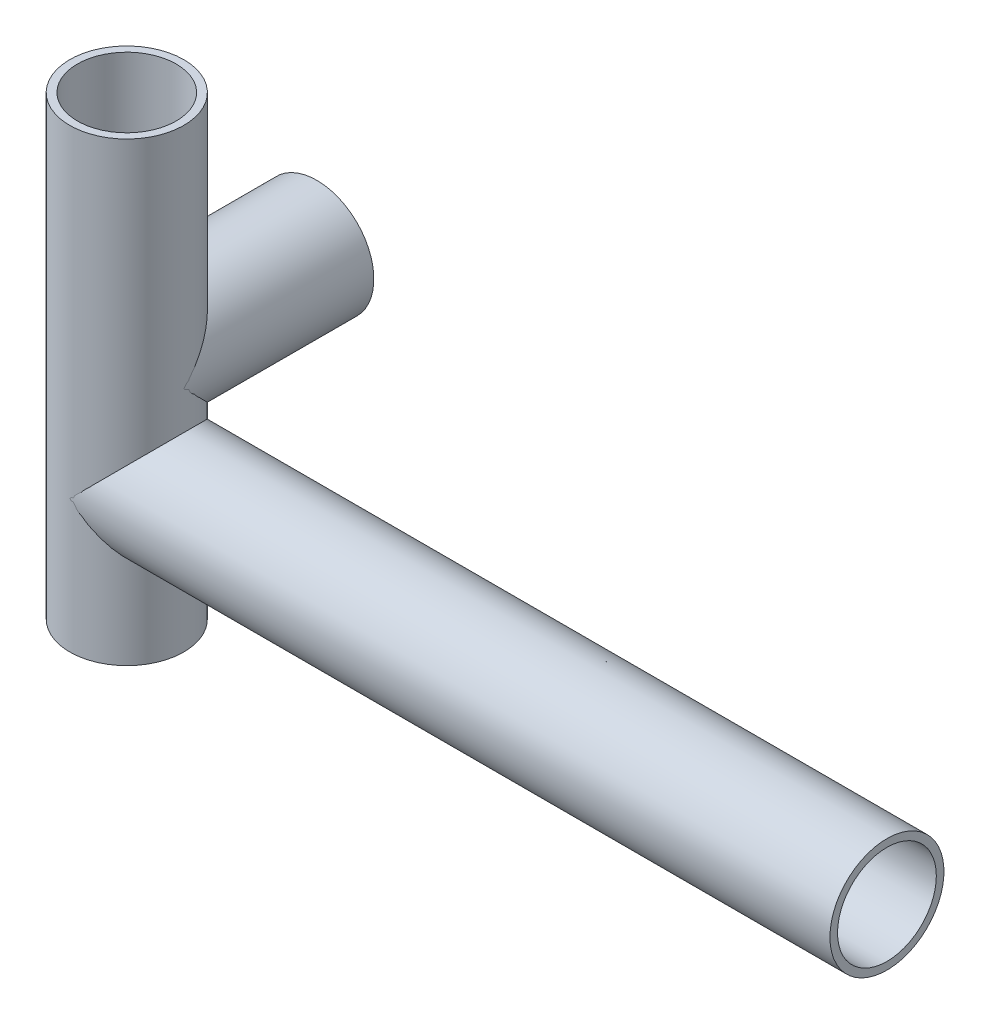
ISO-10303-21;
HEADER;
FILE_DESCRIPTION(('STEP AP214'),'2;1');
FILE_NAME('part.step','',(''),(''),'','','');
FILE_SCHEMA(('AUTOMOTIVE_DESIGN { 1 0 10303 214 1 1 1 1 }'));
ENDSEC;
DATA;
#1=APPLICATION_CONTEXT('core data for automotive mechanical design processes');
#2=APPLICATION_PROTOCOL_DEFINITION('international standard','automotive_design',2000,#1);
#3=PRODUCT_CONTEXT('',#1,'mechanical');
#4=PRODUCT('Part','Part','',(#3));
#5=PRODUCT_RELATED_PRODUCT_CATEGORY('part','',(#4));
#6=PRODUCT_DEFINITION_FORMATION('','',#4);
#7=PRODUCT_DEFINITION_CONTEXT('part definition',#1,'design');
#8=PRODUCT_DEFINITION('design','',#6,#7);
#9=PRODUCT_DEFINITION_SHAPE('','',#8);
#10=(LENGTH_UNIT() NAMED_UNIT(*) SI_UNIT(.MILLI.,.METRE.));
#11=(NAMED_UNIT(*) PLANE_ANGLE_UNIT() SI_UNIT($,.RADIAN.));
#12=(NAMED_UNIT(*) SI_UNIT($,.STERADIAN.) SOLID_ANGLE_UNIT());
#13=UNCERTAINTY_MEASURE_WITH_UNIT(LENGTH_MEASURE(1.E-05),#10,'distance_accuracy_value','');
#14=(GEOMETRIC_REPRESENTATION_CONTEXT(3) GLOBAL_UNCERTAINTY_ASSIGNED_CONTEXT((#13)) GLOBAL_UNIT_ASSIGNED_CONTEXT((#10,
#11,#12)) REPRESENTATION_CONTEXT('',''));
#15=CARTESIAN_POINT('',(0.,0.,0.));
#16=DIRECTION('',(0.,0.,1.));
#17=DIRECTION('',(1.,0.,0.));
#18=AXIS2_PLACEMENT_3D('',#15,#16,#17);
#19=CARTESIAN_POINT('',(200.,33.3215956619923,0.));
#20=DIRECTION('',(-1.,0.,0.));
#21=DIRECTION('',(0.,0.,1.));
#22=AXIS2_PLACEMENT_3D('',#19,#20,#21);
#23=PLANE('',#22);
#24=CARTESIAN_POINT('',(200.,33.3215956619923,0.));
#25=DIRECTION('',(-1.,0.,0.));
#26=DIRECTION('',(0.,0.,1.));
#27=AXIS2_PLACEMENT_3D('',#24,#25,#26);
#28=CIRCLE('',#27,13.);
#29=CARTESIAN_POINT('',(200.,33.3215956619923,13.));
#30=VERTEX_POINT('',#29);
#31=EDGE_CURVE('E87',#30,#30,#28,.T.);
#32=ORIENTED_EDGE('',*,*,#31,.T.);
#33=EDGE_LOOP('',(#32));
#34=FACE_BOUND('',#33,.T.);
#35=CARTESIAN_POINT('',(200.,33.3215956619923,0.));
#36=DIRECTION('',(-1.,0.,0.));
#37=DIRECTION('',(0.,0.,1.));
#38=AXIS2_PLACEMENT_3D('',#35,#36,#37);
#39=CIRCLE('',#38,15.);
#40=CARTESIAN_POINT('',(200.,33.3215956619923,15.));
#41=VERTEX_POINT('',#40);
#42=EDGE_CURVE('E75',#41,#41,#39,.T.);
#43=ORIENTED_EDGE('',*,*,#42,.F.);
#44=EDGE_LOOP('',(#43));
#45=FACE_BOUND('',#44,.T.);
#46=ADVANCED_FACE('F62',(#34,#45),#23,.F.);
#47=CARTESIAN_POINT('',(-33.1,33.3215956619923,0.));
#48=DIRECTION('',(1.,0.,0.));
#49=DIRECTION('',(0.,0.,-1.));
#50=AXIS2_PLACEMENT_3D('',#47,#48,#49);
#51=CYLINDRICAL_SURFACE('',#50,15.);
#52=CARTESIAN_POINT('',(0.,33.3215956619923,0.));
#53=DIRECTION('',(0.707106781186548,-0.707106781186547,0.));
#54=DIRECTION('',(-0.707106781186547,-0.707106781186548,0.));
#55=AXIS2_PLACEMENT_3D('',#52,#53,#54);
#56=ELLIPSE('',#55,21.2132034355964,15.);
#57=CARTESIAN_POINT('',(0.,33.3215956619923,-15.));
#58=VERTEX_POINT('',#57);
#59=CARTESIAN_POINT('',(0.,33.3215956619923,15.));
#60=VERTEX_POINT('',#59);
#61=EDGE_CURVE('E13',#58,#60,#56,.T.);
#62=ORIENTED_EDGE('',*,*,#61,.T.);
#63=CARTESIAN_POINT('',(0.,33.3215956619923,0.));
#64=DIRECTION('',(0.707106781186548,0.707106781186547,0.));
#65=DIRECTION('',(0.707106781186548,-0.707106781186547,0.));
#66=AXIS2_PLACEMENT_3D('',#63,#64,#65);
#67=ELLIPSE('',#66,21.2132034355964,15.);
#68=EDGE_CURVE('E82',#60,#58,#67,.T.);
#69=ORIENTED_EDGE('',*,*,#68,.T.);
#70=EDGE_LOOP('',(#62,#69));
#71=FACE_BOUND('',#70,.T.);
#72=ORIENTED_EDGE('',*,*,#42,.T.);
#73=EDGE_LOOP('',(#72));
#74=FACE_BOUND('',#73,.T.);
#75=ADVANCED_FACE('F85',(#71,#74),#51,.T.);
#76=CARTESIAN_POINT('',(-33.1,33.3215956619923,0.));
#77=DIRECTION('',(1.,0.,0.));
#78=DIRECTION('',(0.,0.,-1.));
#79=AXIS2_PLACEMENT_3D('',#76,#77,#78);
#80=CYLINDRICAL_SURFACE('',#79,13.);
#81=CARTESIAN_POINT('',(7.48331477354791,33.3215956619923,-13.));
#82=CARTESIAN_POINT('',(7.48330032461779,33.5352227300124,-13.000004815656));
#83=CARTESIAN_POINT('',(7.49250358836733,33.7488035739595,-12.9947225538469));
#84=CARTESIAN_POINT('',(7.52872787773292,34.1739950088454,-12.9737699948195));
#85=CARTESIAN_POINT('',(7.55575439498217,34.3856049721381,-12.9580964958846));
#86=CARTESIAN_POINT('',(7.6262083112375,34.8055251412111,-12.9167563207842));
#87=CARTESIAN_POINT('',(7.66967227052028,35.0138269047412,-12.8910673641999));
#88=CARTESIAN_POINT('',(7.77089445184945,35.4255599763329,-12.8303031148432));
#89=CARTESIAN_POINT('',(7.82865878578729,35.6289891610059,-12.7952238081709));
#90=CARTESIAN_POINT('',(7.98369462958647,36.1168765158416,-12.6992952400609));
#91=CARTESIAN_POINT('',(8.08725925657089,36.3984312820975,-12.633857284591));
#92=CARTESIAN_POINT('',(8.31263286079362,36.9497180249535,-12.4867226961187));
#93=CARTESIAN_POINT('',(8.43445214194292,37.219443212432,-12.4050168720378));
#94=CARTESIAN_POINT('',(8.69147425556955,37.7482514279094,-12.2263177494887));
#95=CARTESIAN_POINT('',(8.82671760132815,38.0072986829515,-12.1292776168405));
#96=CARTESIAN_POINT('',(9.10612772166771,38.5145029367969,-11.9209418963201));
#97=CARTESIAN_POINT('',(9.25029383212141,38.7626607437651,-11.8096473687541));
#98=CARTESIAN_POINT('',(9.62619184422613,39.3841636185792,-11.5074960662231));
#99=CARTESIAN_POINT('',(9.86200071545383,39.7503098660572,-11.3068337624086));
#100=CARTESIAN_POINT('',(10.3384211453355,40.4596438964124,-10.8729533620636));
#101=CARTESIAN_POINT('',(10.5790351280131,40.8028196910946,-10.6397184589893));
#102=CARTESIAN_POINT('',(11.0579429424891,41.4659538697362,-10.1410702661326));
#103=CARTESIAN_POINT('',(11.2962389659085,41.7859365110549,-9.87569139471449));
#104=CARTESIAN_POINT('',(11.7649308989509,42.4019849504382,-9.31238939758857));
#105=CARTESIAN_POINT('',(11.99533018992,42.6980610607101,-9.01448043576874));
#106=CARTESIAN_POINT('',(12.3921069078173,43.1999655912032,-8.45722682732462));
#107=CARTESIAN_POINT('',(12.5611469445616,43.4110257902515,-8.20447452414562));
#108=CARTESIAN_POINT('',(12.8888712616614,43.8162231195473,-7.67937177658289));
#109=CARTESIAN_POINT('',(13.0475558477476,44.0103607494674,-7.40702191129012));
#110=CARTESIAN_POINT('',(13.3517861040361,44.379675300549,-6.84340772028994));
#111=CARTESIAN_POINT('',(13.4973493227332,44.5548776101372,-6.55216958033809));
#112=CARTESIAN_POINT('',(13.7729099048448,44.884520379435,-5.95114844674506));
#113=CARTESIAN_POINT('',(13.9029103479139,45.0389649475545,-5.64136914039972));
#114=CARTESIAN_POINT('',(14.1223615565298,45.2984464960555,-5.06321216021355));
#115=CARTESIAN_POINT('',(14.2148703115982,45.4073437047135,-4.79772289400833));
#116=CARTESIAN_POINT('',(14.3862713582789,45.6084819623059,-4.25626491222228));
#117=CARTESIAN_POINT('',(14.465166398038,45.7007263730489,-3.98029832541167));
#118=CARTESIAN_POINT('',(14.6079470267452,45.8672703511128,-3.41930138133727));
#119=CARTESIAN_POINT('',(14.6718378596448,45.9415761881976,-3.13427423038991));
#120=CARTESIAN_POINT('',(14.7834147159342,46.0711225076522,-2.55677977645395));
#121=CARTESIAN_POINT('',(14.8311005592467,46.1263627781565,-2.26431239082479));
#122=CARTESIAN_POINT('',(14.9094691886021,46.2170520652866,-1.67250272507369));
#123=CARTESIAN_POINT('',(14.940063993095,46.252398679867,-1.37313298435978));
#124=CARTESIAN_POINT('',(14.9831905730285,46.3022025600025,-0.771356738396838));
#125=CARTESIAN_POINT('',(14.9957223085219,46.3166597793599,-0.468950226433348));
#126=CARTESIAN_POINT('',(15.0024333815517,46.3244034730238,0.136301468362693));
#127=CARTESIAN_POINT('',(14.9966148926997,46.3176924547396,0.439146594993302));
#128=CARTESIAN_POINT('',(14.9667640071522,46.2832351938175,1.04271875137362));
#129=CARTESIAN_POINT('',(14.9427324990965,46.2554899774687,1.34344588374085));
#130=CARTESIAN_POINT('',(14.8796859932188,46.1825971166457,1.91599381703074));
#131=CARTESIAN_POINT('',(14.8420507474809,46.1390508710022,2.18817406972117));
#132=CARTESIAN_POINT('',(14.7525708800578,46.0353297961591,2.72694248265419));
#133=CARTESIAN_POINT('',(14.7007272029927,45.975156072403,2.99353101338362));
#134=CARTESIAN_POINT('',(14.5837219609498,45.8390297261653,3.51961240345519));
#135=CARTESIAN_POINT('',(14.5185616395594,45.7630785770626,3.77910592280796));
#136=CARTESIAN_POINT('',(14.3759237593629,45.5963277983445,4.28989113696732));
#137=CARTESIAN_POINT('',(14.2984415933814,45.5055226143948,4.54117972139521));
#138=CARTESIAN_POINT('',(14.1263382964299,45.3031011621957,5.05216355866893));
#139=CARTESIAN_POINT('',(14.030887264589,45.1904603799397,5.31117262919994));
#140=CARTESIAN_POINT('',(13.8285209231925,44.9505313639494,5.81777051253195));
#141=CARTESIAN_POINT('',(13.7216011133297,44.8232373789073,6.06535478738197));
#142=CARTESIAN_POINT('',(13.4977213562433,44.5552022541393,6.548466375614));
#143=CARTESIAN_POINT('',(13.380759185378,44.4144581354176,6.78399100014776));
#144=CARTESIAN_POINT('',(13.1381976049428,44.1206282468782,7.24258843909492));
#145=CARTESIAN_POINT('',(13.0125964257093,43.9675399472945,7.46565868522567));
#146=CARTESIAN_POINT('',(12.6880475261444,43.5688407717366,8.00991854428196));
#147=CARTESIAN_POINT('',(12.4844143832583,43.3159225872272,8.32300460032833));
#148=CARTESIAN_POINT('',(12.0650060435883,42.7868176351434,8.92013771134796));
#149=CARTESIAN_POINT('',(11.8492252561981,42.5106201243681,9.20417122350625));
#150=CARTESIAN_POINT('',(11.4095294437049,41.936213258928,9.74392446861584));
#151=CARTESIAN_POINT('',(11.1855961385243,41.6379526643915,9.99957460910132));
#152=CARTESIAN_POINT('',(10.7348826143817,41.0210867061631,10.4819441663041));
#153=CARTESIAN_POINT('',(10.5081032200009,40.7024871306204,10.7086717593324));
#154=CARTESIAN_POINT('',(10.0965321747499,40.1023697931616,11.0961881808996));
#155=CARTESIAN_POINT('',(9.91132569789247,39.8240957428736,11.2615770839488));
#156=CARTESIAN_POINT('',(9.54641609848718,39.2530698383231,11.5725264500693));
#157=CARTESIAN_POINT('',(9.36671417979147,38.9603148531588,11.7180825993625));
#158=CARTESIAN_POINT('',(9.01820146123644,38.3601946498743,11.9883485411959));
#159=CARTESIAN_POINT('',(8.84936298780921,38.0528703252083,12.1131127040167));
#160=CARTESIAN_POINT('',(8.52873071082733,37.4219765879783,12.3409638364446));
#161=CARTESIAN_POINT('',(8.37692391718854,37.0984198322745,12.4440673797315));
#162=CARTESIAN_POINT('',(8.08106101986082,36.3906968735697,12.6385000362852));
#163=CARTESIAN_POINT('',(7.94050987759735,36.0040861285939,12.7266117602572));
#164=CARTESIAN_POINT('',(7.76673370277978,35.4091844129545,12.8328681533836));
#165=CARTESIAN_POINT('',(7.71500747906574,35.2085369313833,12.8639552636135));
#166=CARTESIAN_POINT('',(7.62595816296977,34.8029220232633,12.9169441237709));
#167=CARTESIAN_POINT('',(7.58862734564702,34.5979569760847,12.9388508007014));
#168=CARTESIAN_POINT('',(7.52981714021893,34.1823747520346,12.9731664304263));
#169=CARTESIAN_POINT('',(7.50853666567994,33.9717191273514,12.9854562684648));
#170=CARTESIAN_POINT('',(7.48379731692008,33.5490132206714,12.9997303145311));
#171=CARTESIAN_POINT('',(7.48033699880107,33.336963053063,13.0017153575167));
#172=CARTESIAN_POINT('',(7.49144683702093,32.9134035768395,12.9953169494776));
#173=CARTESIAN_POINT('',(7.50602519122616,32.7018945579417,12.9869287842393));
#174=CARTESIAN_POINT('',(7.55236685956023,32.2814259574719,12.9600330592671));
#175=CARTESIAN_POINT('',(7.58413294356895,32.0724667923719,12.9415238684794));
#176=CARTESIAN_POINT('',(7.66914999284258,31.6273276252515,12.8913506480412));
#177=CARTESIAN_POINT('',(7.72492347033708,31.3918095960806,12.8581206156968));
#178=CARTESIAN_POINT('',(7.85378448470304,30.9274782082325,12.7798172590921));
#179=CARTESIAN_POINT('',(7.92688589633177,30.6986703883667,12.7347344409408));
#180=CARTESIAN_POINT('',(8.08723702487728,30.2478435238612,12.6335108084614));
#181=CARTESIAN_POINT('',(8.17452856471536,30.0258469262021,12.5773371976278));
#182=CARTESIAN_POINT('',(8.36000843831313,29.5894774465135,12.4548238382399));
#183=CARTESIAN_POINT('',(8.45819438635635,29.3751029088882,12.3884863142273));
#184=CARTESIAN_POINT('',(8.73570541092118,28.8035944606104,12.1956044067365));
#185=CARTESIAN_POINT('',(8.92304115577596,28.4534519156588,12.0598137505977));
#186=CARTESIAN_POINT('',(9.31196247052871,27.7726689437787,11.7621224216651));
#187=CARTESIAN_POINT('',(9.51355782322462,27.4420421965976,11.6002037242214));
#188=CARTESIAN_POINT('',(9.92413958092172,26.7985655147786,11.2509651701536));
#189=CARTESIAN_POINT('',(10.1331359561042,26.4857411645744,11.0636100040856));
#190=CARTESIAN_POINT('',(10.5528265585281,25.8777777129622,10.664044145555));
#191=CARTESIAN_POINT('',(10.7635203561976,25.5826342871897,10.4518395685366));
#192=CARTESIAN_POINT('',(11.1956960775142,24.9917257657992,9.98815062097986));
#193=CARTESIAN_POINT('',(11.4170089768437,24.6971216585297,9.7350242005364));
#194=CARTESIAN_POINT('',(11.8521713755514,24.128809656284,9.20026681278124));
#195=CARTESIAN_POINT('',(12.0660194592669,23.8551057133505,8.91863047778808));
#196=CARTESIAN_POINT('',(12.4813907452545,23.3310727872635,8.3273734879751));
#197=CARTESIAN_POINT('',(12.6829400970225,23.0806935680181,8.01781594094474));
#198=CARTESIAN_POINT('',(13.0697891290302,22.6053256516538,7.37039180078412));
#199=CARTESIAN_POINT('',(13.2550956915549,22.3803261890889,7.03253731726715));
#200=CARTESIAN_POINT('',(13.5556266105811,22.0184063368408,6.42842012385462));
#201=CARTESIAN_POINT('',(13.6758870931085,21.8745300629894,6.16880404808346));
#202=CARTESIAN_POINT('',(13.90394065321,21.6030207882139,5.63598741585724));
#203=CARTESIAN_POINT('',(14.0117369169115,21.4753836353742,5.36279035664523));
#204=CARTESIAN_POINT('',(14.2130856242642,21.2378973779852,4.80379178993231));
#205=CARTESIAN_POINT('',(14.3066428385967,21.1280423148995,4.5179945455963));
#206=CARTESIAN_POINT('',(14.4778360871033,20.9276272343289,3.93503881382269));
#207=CARTESIAN_POINT('',(14.5554717950055,20.8370676122549,3.63788009370768));
#208=CARTESIAN_POINT('',(14.6937710913513,20.676097656186,3.03158738055605));
#209=CARTESIAN_POINT('',(14.7542939397482,20.6058543056779,2.72237660571191));
#210=CARTESIAN_POINT('',(14.8561405740246,20.4878197607463,2.09656185683564));
#211=CARTESIAN_POINT('',(14.8974643397773,20.4400285898599,1.77995787505342));
#212=CARTESIAN_POINT('',(14.9598721401341,20.3679050099559,1.14227729025712));
#213=CARTESIAN_POINT('',(14.9809673015676,20.3435597044092,0.82120324474259));
#214=CARTESIAN_POINT('',(15.0024060205379,20.3188180108321,0.177457976470499));
#215=CARTESIAN_POINT('',(15.0027518947885,20.3184189491389,-0.145213063954951));
#216=CARTESIAN_POINT('',(14.9839144758321,20.3401584240185,-0.749968070564535));
#217=CARTESIAN_POINT('',(14.9670934702113,20.3595707657523,-1.03223049483926));
#218=CARTESIAN_POINT('',(14.9177772962452,20.4165468789855,-1.59350735869835));
#219=CARTESIAN_POINT('',(14.8852836452823,20.4541088932843,-1.87252211003577));
#220=CARTESIAN_POINT('',(14.805247648861,20.5467804957945,-2.42542524818794));
#221=CARTESIAN_POINT('',(14.7577045795746,20.6018909280284,-2.69931338775812));
#222=CARTESIAN_POINT('',(14.6484354971255,20.7288316461401,-3.24029314724924));
#223=CARTESIAN_POINT('',(14.5867088005768,20.8006627376436,-3.50738443900009));
#224=CARTESIAN_POINT('',(14.4494275319202,20.9608643878076,-4.0360096598847));
#225=CARTESIAN_POINT('',(14.3737399964556,21.0493941861418,-4.29746056283274));
#226=CARTESIAN_POINT('',(14.210118508006,21.2414467994678,-4.81094396364022));
#227=CARTESIAN_POINT('',(14.1221798583932,21.3449753650474,-5.06297280220391));
#228=CARTESIAN_POINT('',(13.9353256523878,21.5658832560723,-5.5566498141109));
#229=CARTESIAN_POINT('',(13.8364102429352,21.6832623961088,-5.79829812635254));
#230=CARTESIAN_POINT('',(13.6288523983221,21.930802762267,-6.27064333757991));
#231=CARTESIAN_POINT('',(13.5202079637405,22.0609666163219,-6.5013379704895));
#232=CARTESIAN_POINT('',(13.2416217566069,22.3967156180598,-7.05662267833362));
#233=CARTESIAN_POINT('',(13.0667745602973,22.6091050178402,-7.3746704911644));
#234=CARTESIAN_POINT('',(12.7025984861055,23.0564652013179,-7.98564893485581));
#235=CARTESIAN_POINT('',(12.5132638127015,23.2914450317555,-8.27856941342215));
#236=CARTESIAN_POINT('',(12.1233361623318,23.7823298831013,-8.83978162519757));
#237=CARTESIAN_POINT('',(11.9227163364093,24.0382855310617,-9.10801024280584));
#238=CARTESIAN_POINT('',(11.5143349809561,24.5689590632171,-9.61909913261417));
#239=CARTESIAN_POINT('',(11.3065744827913,24.8436742434813,-9.86196304807957));
#240=CARTESIAN_POINT('',(10.8834478494598,25.4166873975873,-10.3272159105889));
#241=CARTESIAN_POINT('',(10.6680128158481,25.7153490193422,-10.549093690495));
#242=CARTESIAN_POINT('',(10.238052154822,26.3311456718633,-10.9668642813446));
#243=CARTESIAN_POINT('',(10.023526841012,26.6482865928587,-11.1627487410569));
#244=CARTESIAN_POINT('',(9.60133472374679,27.3010010242886,-11.5278838828167));
#245=CARTESIAN_POINT('',(9.39365712135372,27.6365430469969,-11.6971782581102));
#246=CARTESIAN_POINT('',(8.99213909754804,28.327813960824,-12.0085699416922));
#247=CARTESIAN_POINT('',(8.79828804316991,28.6835269536624,-12.1506882935595));
#248=CARTESIAN_POINT('',(8.51703908794628,29.2509518423524,-12.3480740873508));
#249=CARTESIAN_POINT('',(8.42117690126761,29.4549548303107,-12.4135337395197));
#250=CARTESIAN_POINT('',(8.2389392318482,29.8698029496247,-12.5352243550162));
#251=CARTESIAN_POINT('',(8.15256039460473,30.0806456271974,-12.5914585851127));
#252=CARTESIAN_POINT('',(7.99206955799775,30.5086975967145,-12.6939309444038));
#253=CARTESIAN_POINT('',(7.91792526382578,30.7258882863112,-12.7401954921791));
#254=CARTESIAN_POINT('',(7.78456732675146,31.1666953328284,-12.8221151710825));
#255=CARTESIAN_POINT('',(7.72534670711915,31.390308632547,-12.8577752611414));
#256=CARTESIAN_POINT('',(7.61327977726052,31.8949158432711,-12.9245198974199));
#257=CARTESIAN_POINT('',(7.56498210899387,32.1773457760189,-12.9526969943518));
#258=CARTESIAN_POINT('',(7.50001576295462,32.7470782338658,-12.9904300153001));
#259=CARTESIAN_POINT('',(7.48333419981949,33.0343787257462,-12.9999935254555));
#260=CARTESIAN_POINT('',(7.48331477354791,33.3215956619923,-13.));
#261=B_SPLINE_CURVE_WITH_KNOTS('',3,(#81,#82,#83,#84,#85,#86,#87,#88,#89,#90,#91,#92,#93,#94,
#95,#96,#97,#98,#99,#100,#101,#102,#103,#104,#105,#106,#107,#108,#109,#110,#111,#112,#113,#114,
#115,#116,#117,#118,#119,#120,#121,#122,#123,#124,#125,#126,#127,#128,#129,#130,#131,#132,#133,
#134,#135,#136,#137,#138,#139,#140,#141,#142,#143,#144,#145,#146,#147,#148,#149,#150,#151,#152,
#153,#154,#155,#156,#157,#158,#159,#160,#161,#162,#163,#164,#165,#166,#167,#168,#169,#170,#171,
#172,#173,#174,#175,#176,#177,#178,#179,#180,#181,#182,#183,#184,#185,#186,#187,#188,#189,#190,
#191,#192,#193,#194,#195,#196,#197,#198,#199,#200,#201,#202,#203,#204,#205,#206,#207,#208,#209,
#210,#211,#212,#213,#214,#215,#216,#217,#218,#219,#220,#221,#222,#223,#224,#225,#226,#227,#228,
#229,#230,#231,#232,#233,#234,#235,#236,#237,#238,#239,#240,#241,#242,#243,#244,#245,#246,#247,
#248,#249,#250,#251,#252,#253,#254,#255,#256,#257,#258,#259,#260),.UNSPECIFIED.,.T.,.F.,(4,2,2,
2,2,2,2,2,2,2,2,2,2,2,2,2,2,2,2,2,2,2,2,2,2,2,2,2,2,2,2,2,2,2,2,2,2,2,2,2,2,2,2,2,2,2,2,2,2,2,2,
2,2,2,2,2,2,2,2,2,2,2,2,2,2,2,2,2,2,2,2,2,2,2,2,2,2,2,2,2,2,2,2,2,2,2,2,2,2,4),(0.,
0.640546705036336,1.28129086515998,1.92346863561456,2.56592134413676,3.48552763805615,
4.4056549763394,5.32864891642608,6.25157423988833,7.68818683192559,9.12554343320675,
10.561374359565,11.9965825867194,13.1060654709905,14.2155155844562,15.3234591967294,
16.4311831988409,17.3348052292767,18.2382446351603,19.1413678186236,20.0445010376869,
20.9522415606526,21.8599840911238,22.7676191021745,23.6752098312403,24.5088811684452,
25.3424970940651,26.1760352072218,27.0098857187966,27.9034355052866,28.7973372091006,
29.6914373591568,30.5857212104145,31.9369443541857,33.2887945259531,34.6438892913097,
35.9986001227708,37.1166755169643,38.2349937143488,39.3503400340676,40.4648298101621,
41.7225869469662,42.350556798092,42.9781891941293,43.6134775750254,44.2487144801582,
44.8842401815141,45.5198683312102,46.2516150482254,46.9839496777857,47.7184832299104,
48.4528562461832,49.7099227286448,50.9678601458539,52.2275619621479,53.4869544145807,
54.8266718677139,56.1666420258718,57.5036560349665,58.8401007670363,59.8000281549952,
60.7597096194714,61.7190688390444,62.6784477163546,63.6455013300257,64.6125559574783,
65.5790783467956,66.5454928210803,67.3947563319661,68.2439376360004,69.0931597890979,
69.9424228674256,70.8002364080107,71.6583797124504,72.5165115307832,73.3748201111019,
74.634519175112,75.8947248262773,77.1580671281404,78.4212277192301,79.7098405082843,
80.9988663104279,82.2857512902051,83.5716357074143,84.2754049594113,84.9789244627005,
85.6805561442444,86.3818592060568,87.2434114953193,88.1046125774115),.UNSPECIFIED.);
#262=CARTESIAN_POINT('',(7.48331477354791,33.3215956619923,-13.));
#263=VERTEX_POINT('',#262);
#264=EDGE_CURVE('E65',#263,#263,#261,.T.);
#265=ORIENTED_EDGE('',*,*,#264,.F.);
#266=EDGE_LOOP('',(#265));
#267=FACE_BOUND('',#266,.T.);
#268=ORIENTED_EDGE('',*,*,#31,.F.);
#269=EDGE_LOOP('',(#268));
#270=FACE_BOUND('',#269,.T.);
#271=ADVANCED_FACE('F97',(#267,#270),#80,.F.);
#272=CARTESIAN_POINT('',(0.,-1.67840433800769,0.));
#273=DIRECTION('',(0.,1.,0.));
#274=DIRECTION('',(0.,0.,1.));
#275=AXIS2_PLACEMENT_3D('',#272,#273,#274);
#276=CYLINDRICAL_SURFACE('',#275,15.);
#277=ORIENTED_EDGE('',*,*,#264,.T.);
#278=EDGE_LOOP('',(#277));
#279=FACE_BOUND('',#278,.T.);
#280=ORIENTED_EDGE('',*,*,#61,.F.);
#281=ORIENTED_EDGE('',*,*,#68,.F.);
#282=EDGE_LOOP('',(#280,#281));
#283=FACE_BOUND('',#282,.T.);
#284=ADVANCED_FACE('F83',(#279,#283),#276,.F.);
#285=CLOSED_SHELL('',(#46,#75,#271,#284));
#286=MANIFOLD_SOLID_BREP('B2',#285);
#287=CARTESIAN_POINT('',(0.,58.3215956619923,-50.));
#288=DIRECTION('',(0.,0.,-1.));
#289=DIRECTION('',(-1.,0.,0.));
#290=AXIS2_PLACEMENT_3D('',#287,#288,#289);
#291=PLANE('',#290);
#292=CARTESIAN_POINT('',(0.,58.3215956619923,-50.));
#293=DIRECTION('',(0.,0.,-1.));
#294=DIRECTION('',(-1.,0.,0.));
#295=AXIS2_PLACEMENT_3D('',#292,#293,#294);
#296=CIRCLE('',#295,13.);
#297=CARTESIAN_POINT('',(-13.,58.3215956619923,-50.));
#298=VERTEX_POINT('',#297);
#299=EDGE_CURVE('E155',#298,#298,#296,.T.);
#300=ORIENTED_EDGE('',*,*,#299,.F.);
#301=EDGE_LOOP('',(#300));
#302=FACE_BOUND('',#301,.T.);
#303=CARTESIAN_POINT('',(0.,58.3215956619923,-50.));
#304=DIRECTION('',(0.,0.,-1.));
#305=DIRECTION('',(-1.,0.,0.));
#306=AXIS2_PLACEMENT_3D('',#303,#304,#305);
#307=CIRCLE('',#306,15.);
#308=CARTESIAN_POINT('',(-15.,58.3215956619923,-50.));
#309=VERTEX_POINT('',#308);
#310=EDGE_CURVE('E60',#309,#309,#307,.T.);
#311=ORIENTED_EDGE('',*,*,#310,.T.);
#312=EDGE_LOOP('',(#311));
#313=FACE_BOUND('',#312,.T.);
#314=ADVANCED_FACE('F142',(#302,#313),#291,.T.);
#315=CARTESIAN_POINT('',(0.,58.3215956619923,0.));
#316=DIRECTION('',(0.,0.,-1.));
#317=DIRECTION('',(-1.,0.,0.));
#318=AXIS2_PLACEMENT_3D('',#315,#316,#317);
#319=CYLINDRICAL_SURFACE('',#318,15.);
#320=CARTESIAN_POINT('',(0.,58.3215956619923,0.));
#321=DIRECTION('',(0.,0.707106781186548,-0.707106781186547));
#322=DIRECTION('',(0.,-0.707106781186547,-0.707106781186547));
#323=AXIS2_PLACEMENT_3D('',#320,#321,#322);
#324=ELLIPSE('',#323,21.2132034355964,15.);
#325=CARTESIAN_POINT('',(-15.,58.3215956619923,0.));
#326=VERTEX_POINT('',#325);
#327=CARTESIAN_POINT('',(15.,58.3215956619923,0.));
#328=VERTEX_POINT('',#327);
#329=EDGE_CURVE('E161',#326,#328,#324,.F.);
#330=ORIENTED_EDGE('',*,*,#329,.F.);
#331=CARTESIAN_POINT('',(0.,58.3215956619923,0.));
#332=DIRECTION('',(0.,-0.707106781186547,-0.707106781186547));
#333=DIRECTION('',(0.,0.707106781186548,-0.707106781186547));
#334=AXIS2_PLACEMENT_3D('',#331,#332,#333);
#335=ELLIPSE('',#334,21.2132034355964,15.);
#336=EDGE_CURVE('E163',#328,#326,#335,.F.);
#337=ORIENTED_EDGE('',*,*,#336,.F.);
#338=EDGE_LOOP('',(#330,#337));
#339=FACE_BOUND('',#338,.T.);
#340=ORIENTED_EDGE('',*,*,#310,.F.);
#341=EDGE_LOOP('',(#340));
#342=FACE_BOUND('',#341,.T.);
#343=ADVANCED_FACE('F168',(#339,#342),#319,.T.);
#344=CARTESIAN_POINT('',(0.,58.3215956619923,0.));
#345=DIRECTION('',(0.,0.,-1.));
#346=DIRECTION('',(-1.,0.,0.));
#347=AXIS2_PLACEMENT_3D('',#344,#345,#346);
#348=CYLINDRICAL_SURFACE('',#347,13.);
#349=CARTESIAN_POINT('',(-13.,58.3215956619923,-7.48331477354789));
#350=CARTESIAN_POINT('',(-13.000004815656,58.1079685939723,-7.48330032461777));
#351=CARTESIAN_POINT('',(-12.9947225538469,57.8943877500252,-7.49250358836731));
#352=CARTESIAN_POINT('',(-12.9737699948195,57.4691963151393,-7.52872787773291));
#353=CARTESIAN_POINT('',(-12.9580964958846,57.2575863518465,-7.55575439498216));
#354=CARTESIAN_POINT('',(-12.9167563207842,56.8376661827735,-7.62620831123749));
#355=CARTESIAN_POINT('',(-12.8910673641999,56.6293644192434,-7.66967227052027));
#356=CARTESIAN_POINT('',(-12.8303031148432,56.2176313476518,-7.77089445184944));
#357=CARTESIAN_POINT('',(-12.7952238081709,56.0142021629787,-7.82865878578728));
#358=CARTESIAN_POINT('',(-12.6992952400609,55.5263148081431,-7.98369462958646));
#359=CARTESIAN_POINT('',(-12.633857284591,55.2447600418871,-8.08725925657089));
#360=CARTESIAN_POINT('',(-12.4867226961187,54.6934732990311,-8.31263286079362));
#361=CARTESIAN_POINT('',(-12.4050168720378,54.4237481115526,-8.43445214194292));
#362=CARTESIAN_POINT('',(-12.2263177494887,53.8949398960752,-8.69147425556955));
#363=CARTESIAN_POINT('',(-12.1292776168405,53.6358926410332,-8.82671760132814));
#364=CARTESIAN_POINT('',(-11.9209418963201,53.1286883871877,-9.10612772166771));
#365=CARTESIAN_POINT('',(-11.8096473687541,52.8805305802196,-9.25029383212141));
#366=CARTESIAN_POINT('',(-11.5074960662231,52.2590277054055,-9.62619184422613));
#367=CARTESIAN_POINT('',(-11.3068337624086,51.8928814579274,-9.86200071545384));
#368=CARTESIAN_POINT('',(-10.8729533620636,51.1835474275722,-10.3384211453355));
#369=CARTESIAN_POINT('',(-10.6397184589893,50.84037163289,-10.5790351280131));
#370=CARTESIAN_POINT('',(-10.1410702661326,50.1772374542484,-11.0579429424891));
#371=CARTESIAN_POINT('',(-9.87569139471448,49.8572548129298,-11.2962389659085));
#372=CARTESIAN_POINT('',(-9.31238939758857,49.2412063735465,-11.7649308989509));
#373=CARTESIAN_POINT('',(-9.01448043576872,48.9451302632745,-11.99533018992));
#374=CARTESIAN_POINT('',(-8.4572268273246,48.4432257327815,-12.3921069078173));
#375=CARTESIAN_POINT('',(-8.20447452414561,48.2321655337331,-12.5611469445616));
#376=CARTESIAN_POINT('',(-7.67937177658288,47.8269682044373,-12.8888712616615));
#377=CARTESIAN_POINT('',(-7.40702191129011,47.6328305745173,-13.0475558477476));
#378=CARTESIAN_POINT('',(-6.84340772028993,47.2635160234357,-13.3517861040361));
#379=CARTESIAN_POINT('',(-6.55216958033807,47.0883137138475,-13.4973493227332));
#380=CARTESIAN_POINT('',(-5.95114844674505,46.7586709445497,-13.7729099048448));
#381=CARTESIAN_POINT('',(-5.64136914039971,46.6042263764301,-13.9029103479139));
#382=CARTESIAN_POINT('',(-5.06321216021354,46.3447448279291,-14.1223615565298));
#383=CARTESIAN_POINT('',(-4.79772289400832,46.2358476192711,-14.2148703115982));
#384=CARTESIAN_POINT('',(-4.25626491222227,46.0347093616788,-14.3862713582789));
#385=CARTESIAN_POINT('',(-3.98029832541166,45.9424649509357,-14.4651663980381));
#386=CARTESIAN_POINT('',(-3.41930138133726,45.7759209728718,-14.6079470267453));
#387=CARTESIAN_POINT('',(-3.1342742303899,45.701615135787,-14.6718378596448));
#388=CARTESIAN_POINT('',(-2.55677977645395,45.5720688163325,-14.7834147159342));
#389=CARTESIAN_POINT('',(-2.26431239082479,45.5168285458281,-14.8311005592467));
#390=CARTESIAN_POINT('',(-1.67250272507369,45.426139258698,-14.9094691886021));
#391=CARTESIAN_POINT('',(-1.37313298435977,45.3907926441177,-14.940063993095));
#392=CARTESIAN_POINT('',(-0.771356738396835,45.3409887639821,-14.9831905730285));
#393=CARTESIAN_POINT('',(-0.468950226433345,45.3265315446247,-14.9957223085219));
#394=CARTESIAN_POINT('',(0.136301468362696,45.3187878509609,-15.0024333815517));
#395=CARTESIAN_POINT('',(0.439146594993305,45.325498869245,-14.9966148926997));
#396=CARTESIAN_POINT('',(1.04271875137362,45.3599561301672,-14.9667640071522));
#397=CARTESIAN_POINT('',(1.34344588374085,45.3877013465159,-14.9427324990965));
#398=CARTESIAN_POINT('',(1.91599381703074,45.4605942073389,-14.8796859932189));
#399=CARTESIAN_POINT('',(2.18817406972117,45.5041404529824,-14.8420507474809));
#400=CARTESIAN_POINT('',(2.72694248265419,45.6078615278255,-14.7525708800578));
#401=CARTESIAN_POINT('',(2.99353101338361,45.6680352515817,-14.7007272029927));
#402=CARTESIAN_POINT('',(3.51961240345519,45.8041615978193,-14.5837219609498));
#403=CARTESIAN_POINT('',(3.77910592280796,45.880112746922,-14.5185616395594));
#404=CARTESIAN_POINT('',(4.28989113696732,46.0468635256402,-14.3759237593629));
#405=CARTESIAN_POINT('',(4.54117972139521,46.1376687095899,-14.2984415933814));
#406=CARTESIAN_POINT('',(5.05216355866893,46.340090161789,-14.1263382964299));
#407=CARTESIAN_POINT('',(5.31117262919993,46.452730944045,-14.0308872645891));
#408=CARTESIAN_POINT('',(5.81777051253194,46.6926599600352,-13.8285209231925));
#409=CARTESIAN_POINT('',(6.06535478738196,46.8199539450773,-13.7216011133297));
#410=CARTESIAN_POINT('',(6.54846637561399,47.0879890698454,-13.4977213562433));
#411=CARTESIAN_POINT('',(6.78399100014775,47.228733188567,-13.380759185378));
#412=CARTESIAN_POINT('',(7.24258843909492,47.5225630771065,-13.1381976049428));
#413=CARTESIAN_POINT('',(7.46565868522566,47.6756513766901,-13.0125964257093));
#414=CARTESIAN_POINT('',(8.00991854428195,48.074350552248,-12.6880475261444));
#415=CARTESIAN_POINT('',(8.32300460032833,48.3272687367575,-12.4844143832583));
#416=CARTESIAN_POINT('',(8.92013771134796,48.8563736888413,-12.0650060435883));
#417=CARTESIAN_POINT('',(9.20417122350625,49.1325711996165,-11.8492252561982));
#418=CARTESIAN_POINT('',(9.74392446861584,49.7069780650567,-11.4095294437049));
#419=CARTESIAN_POINT('',(9.99957460910132,50.0052386595931,-11.1855961385243));
#420=CARTESIAN_POINT('',(10.4819441663041,50.6221046178216,-10.7348826143817));
#421=CARTESIAN_POINT('',(10.7086717593324,50.9407041933642,-10.508103220001));
#422=CARTESIAN_POINT('',(11.0961881808996,51.540821530823,-10.0965321747499));
#423=CARTESIAN_POINT('',(11.2615770839488,51.819095581111,-9.91132569789249));
#424=CARTESIAN_POINT('',(11.5725264500693,52.3901214856615,-9.5464160984872));
#425=CARTESIAN_POINT('',(11.7180825993625,52.6828764708259,-9.36671417979148));
#426=CARTESIAN_POINT('',(11.9883485411959,53.2829966741103,-9.01820146123646));
#427=CARTESIAN_POINT('',(12.1131127040167,53.5903209987764,-8.84936298780923));
#428=CARTESIAN_POINT('',(12.3409638364446,54.2212147360063,-8.52873071082735));
#429=CARTESIAN_POINT('',(12.4440673797315,54.5447714917102,-8.37692391718856));
#430=CARTESIAN_POINT('',(12.6385000362852,55.2524944504149,-8.08106101986084));
#431=CARTESIAN_POINT('',(12.7266117602572,55.6391051953907,-7.94050987759738));
#432=CARTESIAN_POINT('',(12.8328681533836,56.2340069110301,-7.7667337027798));
#433=CARTESIAN_POINT('',(12.8639552636135,56.4346543926013,-7.71500747906576));
#434=CARTESIAN_POINT('',(12.9169441237709,56.8402693007213,-7.62595816296979));
#435=CARTESIAN_POINT('',(12.9388508007014,57.0452343478999,-7.58862734564704));
#436=CARTESIAN_POINT('',(12.9731664304263,57.4608165719501,-7.52981714021896));
#437=CARTESIAN_POINT('',(12.9854562684648,57.6714721966332,-7.50853666567996));
#438=CARTESIAN_POINT('',(12.9997303145311,58.0941781033133,-7.4837973169201));
#439=CARTESIAN_POINT('',(13.0017153575167,58.3062282709217,-7.48033699880109));
#440=CARTESIAN_POINT('',(12.9953169494776,58.7297877471452,-7.49144683702096));
#441=CARTESIAN_POINT('',(12.9869287842393,58.941296766043,-7.50602519122619));
#442=CARTESIAN_POINT('',(12.9600330592671,59.3617653665128,-7.55236685956026));
#443=CARTESIAN_POINT('',(12.9415238684794,59.5707245316128,-7.58413294356899));
#444=CARTESIAN_POINT('',(12.8913506480412,60.0158636987332,-7.66914999284261));
#445=CARTESIAN_POINT('',(12.8581206156968,60.2513817279041,-7.7249234703371));
#446=CARTESIAN_POINT('',(12.7798172590921,60.7157131157521,-7.85378448470307));
#447=CARTESIAN_POINT('',(12.7347344409408,60.9445209356179,-7.9268858963318));
#448=CARTESIAN_POINT('',(12.6335108084614,61.3953478001235,-8.08723702487731));
#449=CARTESIAN_POINT('',(12.5773371976278,61.6173443977826,-8.17452856471539));
#450=CARTESIAN_POINT('',(12.4548238382399,62.0537138774711,-8.36000843831316));
#451=CARTESIAN_POINT('',(12.3884863142273,62.2680884150965,-8.45819438635638));
#452=CARTESIAN_POINT('',(12.1956044067365,62.8395968633743,-8.7357054109212));
#453=CARTESIAN_POINT('',(12.0598137505977,63.1897394083258,-8.92304115577598));
#454=CARTESIAN_POINT('',(11.7621224216651,63.8705223802059,-9.31196247052874));
#455=CARTESIAN_POINT('',(11.6002037242214,64.201149127387,-9.51355782322465));
#456=CARTESIAN_POINT('',(11.2509651701536,64.8446258092061,-9.92413958092175));
#457=CARTESIAN_POINT('',(11.0636100040856,65.1574501594103,-10.1331359561042));
#458=CARTESIAN_POINT('',(10.664044145555,65.7654136110224,-10.5528265585281));
#459=CARTESIAN_POINT('',(10.4518395685366,66.060557036795,-10.7635203561976));
#460=CARTESIAN_POINT('',(9.98815062097986,66.6514655581854,-11.1956960775142));
#461=CARTESIAN_POINT('',(9.7350242005364,66.9460696654549,-11.4170089768438));
#462=CARTESIAN_POINT('',(9.20026681278123,67.5143816677006,-11.8521713755514));
#463=CARTESIAN_POINT('',(8.91863047778808,67.7880856106342,-12.0660194592669));
#464=CARTESIAN_POINT('',(8.3273734879751,68.3121185367212,-12.4813907452545));
#465=CARTESIAN_POINT('',(8.01781594094474,68.5624977559665,-12.6829400970225));
#466=CARTESIAN_POINT('',(7.37039180078412,69.0378656723309,-13.0697891290302));
#467=CARTESIAN_POINT('',(7.03253731726715,69.2628651348957,-13.2550956915549));
#468=CARTESIAN_POINT('',(6.42842012385461,69.6247849871438,-13.5556266105811));
#469=CARTESIAN_POINT('',(6.16880404808346,69.7686612609953,-13.6758870931085));
#470=CARTESIAN_POINT('',(5.63598741585723,70.0401705357708,-13.9039406532101));
#471=CARTESIAN_POINT('',(5.36279035664523,70.1678076886105,-14.0117369169115));
#472=CARTESIAN_POINT('',(4.8037917899323,70.4052939459994,-14.2130856242642));
#473=CARTESIAN_POINT('',(4.51799454559629,70.5151490090851,-14.3066428385967));
#474=CARTESIAN_POINT('',(3.93503881382267,70.7155640896558,-14.4778360871033));
#475=CARTESIAN_POINT('',(3.63788009370766,70.8061237117297,-14.5554717950055));
#476=CARTESIAN_POINT('',(3.03158738055604,70.9670936677987,-14.6937710913513));
#477=CARTESIAN_POINT('',(2.72237660571189,71.0373370183068,-14.7542939397482));
#478=CARTESIAN_POINT('',(2.09656185683563,71.1553715632384,-14.8561405740246));
#479=CARTESIAN_POINT('',(1.77995787505341,71.2031627341248,-14.8974643397773));
#480=CARTESIAN_POINT('',(1.14227729025711,71.2752863140287,-14.9598721401341));
#481=CARTESIAN_POINT('',(0.821203244742578,71.2996316195755,-14.9809673015676));
#482=CARTESIAN_POINT('',(0.177457976470488,71.3243733131526,-15.0024060205379));
#483=CARTESIAN_POINT('',(-0.145213063954962,71.3247723748457,-15.0027518947885));
#484=CARTESIAN_POINT('',(-0.749968070564546,71.3030328999661,-14.9839144758321));
#485=CARTESIAN_POINT('',(-1.03223049483927,71.2836205582324,-14.9670934702113));
#486=CARTESIAN_POINT('',(-1.59350735869836,71.2266444449992,-14.9177772962452));
#487=CARTESIAN_POINT('',(-1.87252211003578,71.1890824307004,-14.8852836452823));
#488=CARTESIAN_POINT('',(-2.42542524818795,71.0964108281902,-14.805247648861));
#489=CARTESIAN_POINT('',(-2.69931338775813,71.0413003959563,-14.7577045795746));
#490=CARTESIAN_POINT('',(-3.24029314724925,70.9143596778445,-14.6484354971255));
#491=CARTESIAN_POINT('',(-3.5073844390001,70.842528586341,-14.5867088005768));
#492=CARTESIAN_POINT('',(-4.03600965988471,70.682326936177,-14.4494275319202));
#493=CARTESIAN_POINT('',(-4.29746056283275,70.5937971378428,-14.3737399964556));
#494=CARTESIAN_POINT('',(-4.81094396364023,70.4017445245168,-14.210118508006));
#495=CARTESIAN_POINT('',(-5.06297280220392,70.2982159589372,-14.1221798583932));
#496=CARTESIAN_POINT('',(-5.5566498141109,70.0773080679123,-13.9353256523878));
#497=CARTESIAN_POINT('',(-5.79829812635255,69.9599289278758,-13.8364102429352));
#498=CARTESIAN_POINT('',(-6.27064333757992,69.7123885617176,-13.6288523983221));
#499=CARTESIAN_POINT('',(-6.50133797048952,69.5822247076627,-13.5202079637405));
#500=CARTESIAN_POINT('',(-7.05662267833363,69.2464757059249,-13.2416217566069));
#501=CARTESIAN_POINT('',(-7.3746704911644,69.0340863061445,-13.0667745602973));
#502=CARTESIAN_POINT('',(-7.98564893485582,68.5867261226668,-12.7025984861055));
#503=CARTESIAN_POINT('',(-8.27856941342216,68.3517462922292,-12.5132638127015));
#504=CARTESIAN_POINT('',(-8.83978162519759,67.8608614408834,-12.1233361623318));
#505=CARTESIAN_POINT('',(-9.10801024280586,67.6049057929229,-11.9227163364092));
#506=CARTESIAN_POINT('',(-9.61909913261419,67.0742322607675,-11.5143349809561));
#507=CARTESIAN_POINT('',(-9.86196304807958,66.7995170805033,-11.3065744827913));
#508=CARTESIAN_POINT('',(-10.3272159105889,66.2265039263974,-10.8834478494597));
#509=CARTESIAN_POINT('',(-10.549093690495,65.9278423046425,-10.6680128158481));
#510=CARTESIAN_POINT('',(-10.9668642813446,65.3120456521213,-10.2380521548219));
#511=CARTESIAN_POINT('',(-11.1627487410569,64.9949047311259,-10.023526841012));
#512=CARTESIAN_POINT('',(-11.5278838828168,64.342190299696,-9.60133472374676));
#513=CARTESIAN_POINT('',(-11.6971782581102,64.0066482769877,-9.3936571213537));
#514=CARTESIAN_POINT('',(-12.0085699416922,63.3153773631607,-8.99213909754802));
#515=CARTESIAN_POINT('',(-12.1506882935595,62.9596643703222,-8.79828804316988));
#516=CARTESIAN_POINT('',(-12.3480740873508,62.3922394816322,-8.51703908794626));
#517=CARTESIAN_POINT('',(-12.4135337395197,62.1882364936739,-8.4211769012676));
#518=CARTESIAN_POINT('',(-12.5352243550162,61.7733883743599,-8.23893923184818));
#519=CARTESIAN_POINT('',(-12.5914585851127,61.5625456967872,-8.15256039460471));
#520=CARTESIAN_POINT('',(-12.6939309444038,61.1344937272701,-7.99206955799773));
#521=CARTESIAN_POINT('',(-12.7401954921791,60.9173030376734,-7.91792526382577));
#522=CARTESIAN_POINT('',(-12.8221151710825,60.4764959911562,-7.78456732675144));
#523=CARTESIAN_POINT('',(-12.8577752611414,60.2528826914376,-7.72534670711913));
#524=CARTESIAN_POINT('',(-12.9245198974199,59.7482754807135,-7.6132797772605));
#525=CARTESIAN_POINT('',(-12.9526969943518,59.4658455479657,-7.56498210899386));
#526=CARTESIAN_POINT('',(-12.9904300153001,58.8961130901188,-7.50001576295461));
#527=CARTESIAN_POINT('',(-12.9999935254555,58.6088125982384,-7.48333419981947));
#528=CARTESIAN_POINT('',(-13.,58.3215956619923,-7.48331477354789));
#529=B_SPLINE_CURVE_WITH_KNOTS('',3,(#349,#350,#351,#352,#353,#354,#355,#356,#357,#358,#359,
#360,#361,#362,#363,#364,#365,#366,#367,#368,#369,#370,#371,#372,#373,#374,#375,#376,#377,#378,
#379,#380,#381,#382,#383,#384,#385,#386,#387,#388,#389,#390,#391,#392,#393,#394,#395,#396,#397,
#398,#399,#400,#401,#402,#403,#404,#405,#406,#407,#408,#409,#410,#411,#412,#413,#414,#415,#416,
#417,#418,#419,#420,#421,#422,#423,#424,#425,#426,#427,#428,#429,#430,#431,#432,#433,#434,#435,
#436,#437,#438,#439,#440,#441,#442,#443,#444,#445,#446,#447,#448,#449,#450,#451,#452,#453,#454,
#455,#456,#457,#458,#459,#460,#461,#462,#463,#464,#465,#466,#467,#468,#469,#470,#471,#472,#473,
#474,#475,#476,#477,#478,#479,#480,#481,#482,#483,#484,#485,#486,#487,#488,#489,#490,#491,#492,
#493,#494,#495,#496,#497,#498,#499,#500,#501,#502,#503,#504,#505,#506,#507,#508,#509,#510,#511,
#512,#513,#514,#515,#516,#517,#518,#519,#520,#521,#522,#523,#524,#525,#526,#527,#528),
.UNSPECIFIED.,.T.,.F.,(4,2,2,2,2,2,2,2,2,2,2,2,2,2,2,2,2,2,2,2,2,2,2,2,2,2,2,2,2,2,2,2,2,2,2,2,
2,2,2,2,2,2,2,2,2,2,2,2,2,2,2,2,2,2,2,2,2,2,2,2,2,2,2,2,2,2,2,2,2,2,2,2,2,2,2,2,2,2,2,2,2,2,2,2,
2,2,2,2,2,4),(0.,0.640546705036336,1.28129086515999,1.92346863561456,2.56592134413676,
3.48552763805616,4.40565497633941,5.32864891642609,6.25157423988834,7.6881868319256,
9.12554343320677,10.561374359565,11.9965825867195,13.1060654709906,14.2155155844563,
15.3234591967294,16.4311831988409,17.3348052292767,18.2382446351603,19.1413678186236,
20.0445010376869,20.9522415606526,21.8599840911238,22.7676191021745,23.6752098312403,
24.5088811684452,25.3424970940651,26.1760352072218,27.0098857187966,27.9034355052866,
28.7973372091006,29.6914373591568,30.5857212104145,31.9369443541857,33.2887945259531,
34.6438892913097,35.9986001227708,37.1166755169643,38.2349937143488,39.3503400340676,
40.4648298101621,41.7225869469662,42.350556798092,42.9781891941293,43.6134775750253,
44.2487144801582,44.8842401815141,45.5198683312102,46.2516150482254,46.9839496777857,
47.7184832299104,48.4528562461832,49.7099227286448,50.9678601458539,52.2275619621479,
53.4869544145807,54.8266718677139,56.1666420258718,57.5036560349665,58.8401007670363,
59.8000281549952,60.7597096194713,61.7190688390444,62.6784477163546,63.6455013300257,
64.6125559574783,65.5790783467956,66.5454928210803,67.3947563319661,68.2439376360004,
69.0931597890979,69.9424228674256,70.8002364080107,71.6583797124504,72.5165115307832,
73.3748201111019,74.634519175112,75.8947248262773,77.1580671281404,78.4212277192302,
79.7098405082844,80.9988663104279,82.2857512902052,83.5716357074144,84.2754049594114,
84.9789244627005,85.6805561442445,86.3818592060568,87.2434114953193,88.1046125774115),.UNSPECIFIED.);
#530=CARTESIAN_POINT('',(-13.,58.3215956619923,-7.48331477354789));
#531=VERTEX_POINT('',#530);
#532=EDGE_CURVE('E145',#531,#531,#529,.T.);
#533=ORIENTED_EDGE('',*,*,#532,.T.);
#534=EDGE_LOOP('',(#533));
#535=FACE_BOUND('',#534,.T.);
#536=ORIENTED_EDGE('',*,*,#299,.T.);
#537=EDGE_LOOP('',(#536));
#538=FACE_BOUND('',#537,.T.);
#539=ADVANCED_FACE('F175',(#535,#538),#348,.F.);
#540=CARTESIAN_POINT('',(0.,-66.6784043380077,0.));
#541=DIRECTION('',(0.,1.,0.));
#542=DIRECTION('',(0.,0.,1.));
#543=AXIS2_PLACEMENT_3D('',#540,#541,#542);
#544=CYLINDRICAL_SURFACE('',#543,15.);
#545=ORIENTED_EDGE('',*,*,#329,.T.);
#546=ORIENTED_EDGE('',*,*,#336,.T.);
#547=EDGE_LOOP('',(#545,#546));
#548=FACE_BOUND('',#547,.T.);
#549=ORIENTED_EDGE('',*,*,#532,.F.);
#550=EDGE_LOOP('',(#549));
#551=FACE_BOUND('',#550,.T.);
#552=ADVANCED_FACE('F164',(#548,#551),#544,.F.);
#553=CLOSED_SHELL('',(#314,#343,#539,#552));
#554=MANIFOLD_SOLID_BREP('B7',#553);
#555=CARTESIAN_POINT('',(0.,118.321595661992,0.));
#556=DIRECTION('',(0.,-1.,0.));
#557=DIRECTION('',(0.,0.,-1.));
#558=AXIS2_PLACEMENT_3D('',#555,#556,#557);
#559=PLANE('',#558);
#560=CARTESIAN_POINT('',(0.,118.321595661992,0.));
#561=DIRECTION('',(0.,-1.,0.));
#562=DIRECTION('',(0.,0.,-1.));
#563=AXIS2_PLACEMENT_3D('',#560,#561,#562);
#564=CIRCLE('',#563,13.);
#565=CARTESIAN_POINT('',(0.,118.321595661992,-13.));
#566=VERTEX_POINT('',#565);
#567=EDGE_CURVE('E229',#566,#566,#564,.T.);
#568=ORIENTED_EDGE('',*,*,#567,.T.);
#569=EDGE_LOOP('',(#568));
#570=FACE_BOUND('',#569,.T.);
#571=CARTESIAN_POINT('',(0.,118.321595661992,0.));
#572=DIRECTION('',(0.,-1.,0.));
#573=DIRECTION('',(0.,0.,-1.));
#574=AXIS2_PLACEMENT_3D('',#571,#572,#573);
#575=CIRCLE('',#574,15.);
#576=CARTESIAN_POINT('',(0.,118.321595661992,-15.));
#577=VERTEX_POINT('',#576);
#578=EDGE_CURVE('E221',#577,#577,#575,.T.);
#579=ORIENTED_EDGE('',*,*,#578,.F.);
#580=EDGE_LOOP('',(#579));
#581=FACE_BOUND('',#580,.T.);
#582=ADVANCED_FACE('F215',(#570,#581),#559,.F.);
#583=CARTESIAN_POINT('',(0.,-1.67840433800767,0.));
#584=DIRECTION('',(0.,-1.,0.));
#585=DIRECTION('',(0.,0.,-1.));
#586=AXIS2_PLACEMENT_3D('',#583,#584,#585);
#587=PLANE('',#586);
#588=CARTESIAN_POINT('',(0.,-1.67840433800767,0.));
#589=DIRECTION('',(0.,-1.,0.));
#590=DIRECTION('',(0.,0.,-1.));
#591=AXIS2_PLACEMENT_3D('',#588,#589,#590);
#592=CIRCLE('',#591,13.);
#593=CARTESIAN_POINT('',(0.,-1.67840433800767,-13.));
#594=VERTEX_POINT('',#593);
#595=EDGE_CURVE('E225',#594,#594,#592,.T.);
#596=ORIENTED_EDGE('',*,*,#595,.F.);
#597=EDGE_LOOP('',(#596));
#598=FACE_BOUND('',#597,.T.);
#599=CARTESIAN_POINT('',(0.,-1.67840433800767,0.));
#600=DIRECTION('',(0.,-1.,0.));
#601=DIRECTION('',(0.,0.,-1.));
#602=AXIS2_PLACEMENT_3D('',#599,#600,#601);
#603=CIRCLE('',#602,15.);
#604=CARTESIAN_POINT('',(0.,-1.67840433800767,-15.));
#605=VERTEX_POINT('',#604);
#606=EDGE_CURVE('E141',#605,#605,#603,.T.);
#607=ORIENTED_EDGE('',*,*,#606,.T.);
#608=EDGE_LOOP('',(#607));
#609=FACE_BOUND('',#608,.T.);
#610=ADVANCED_FACE('F245',(#598,#609),#587,.T.);
#611=CARTESIAN_POINT('',(0.,118.321595661992,0.));
#612=DIRECTION('',(0.,-1.,0.));
#613=DIRECTION('',(0.,0.,-1.));
#614=AXIS2_PLACEMENT_3D('',#611,#612,#613);
#615=CYLINDRICAL_SURFACE('',#614,15.);
#616=ORIENTED_EDGE('',*,*,#606,.F.);
#617=EDGE_LOOP('',(#616));
#618=FACE_BOUND('',#617,.T.);
#619=ORIENTED_EDGE('',*,*,#578,.T.);
#620=EDGE_LOOP('',(#619));
#621=FACE_BOUND('',#620,.T.);
#622=ADVANCED_FACE('F239',(#618,#621),#615,.T.);
#623=CARTESIAN_POINT('',(0.,118.321595661992,0.));
#624=DIRECTION('',(0.,-1.,0.));
#625=DIRECTION('',(0.,0.,-1.));
#626=AXIS2_PLACEMENT_3D('',#623,#624,#625);
#627=CYLINDRICAL_SURFACE('',#626,13.);
#628=ORIENTED_EDGE('',*,*,#595,.T.);
#629=EDGE_LOOP('',(#628));
#630=FACE_BOUND('',#629,.T.);
#631=ORIENTED_EDGE('',*,*,#567,.F.);
#632=EDGE_LOOP('',(#631));
#633=FACE_BOUND('',#632,.T.);
#634=ADVANCED_FACE('F237',(#630,#633),#627,.F.);
#635=CLOSED_SHELL('',(#582,#610,#622,#634));
#636=MANIFOLD_SOLID_BREP('B54',#635);
#637=ADVANCED_BREP_SHAPE_REPRESENTATION('',(#18,#286,#554,#636),#14);
#638=SHAPE_DEFINITION_REPRESENTATION(#9,#637);
ENDSEC;
END-ISO-10303-21;
